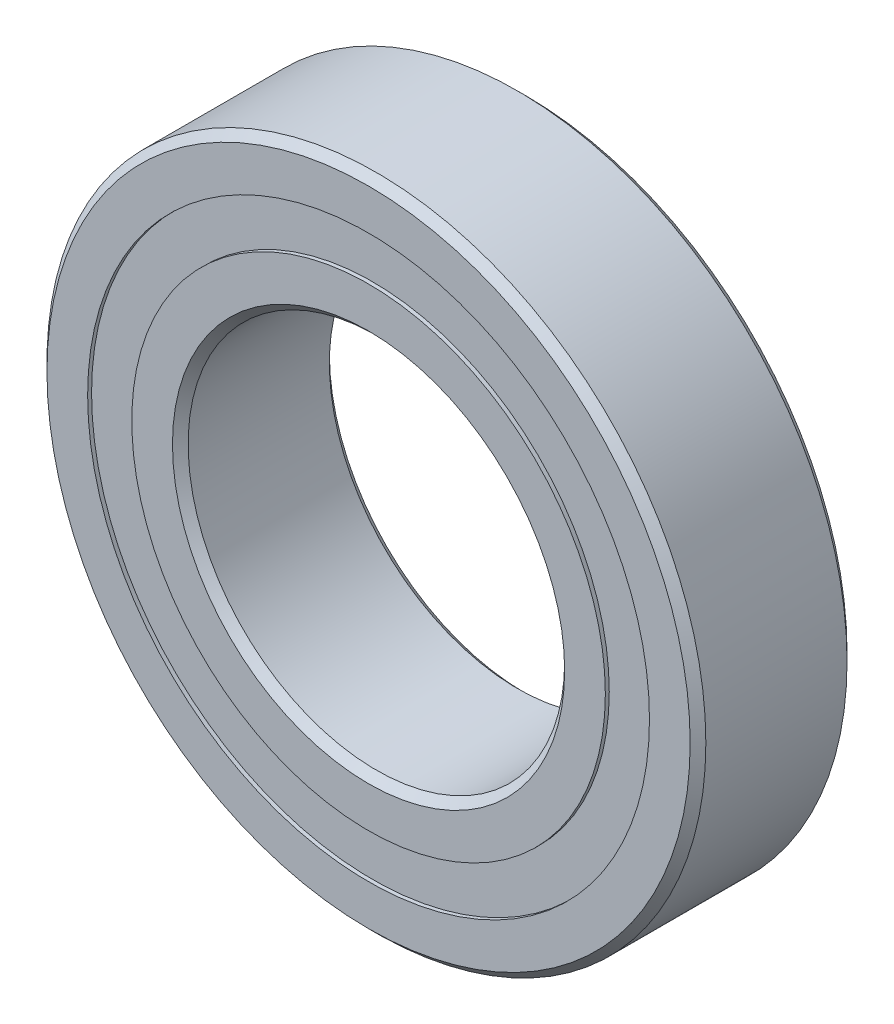
ISO-10303-21;
HEADER;
FILE_DESCRIPTION(('STEP AP214'),'2;1');
FILE_NAME('part.step','',(''),(''),'','','');
FILE_SCHEMA(('AUTOMOTIVE_DESIGN { 1 0 10303 214 1 1 1 1 }'));
ENDSEC;
DATA;
#1=APPLICATION_CONTEXT('core data for automotive mechanical design processes');
#2=APPLICATION_PROTOCOL_DEFINITION('international standard','automotive_design',2000,#1);
#3=PRODUCT_CONTEXT('',#1,'mechanical');
#4=PRODUCT('Part','Part','',(#3));
#5=PRODUCT_RELATED_PRODUCT_CATEGORY('part','',(#4));
#6=PRODUCT_DEFINITION_FORMATION('','',#4);
#7=PRODUCT_DEFINITION_CONTEXT('part definition',#1,'design');
#8=PRODUCT_DEFINITION('design','',#6,#7);
#9=PRODUCT_DEFINITION_SHAPE('','',#8);
#10=(LENGTH_UNIT() NAMED_UNIT(*) SI_UNIT(.MILLI.,.METRE.));
#11=(NAMED_UNIT(*) PLANE_ANGLE_UNIT() SI_UNIT($,.RADIAN.));
#12=(NAMED_UNIT(*) SI_UNIT($,.STERADIAN.) SOLID_ANGLE_UNIT());
#13=UNCERTAINTY_MEASURE_WITH_UNIT(LENGTH_MEASURE(1.E-05),#10,'distance_accuracy_value','');
#14=(GEOMETRIC_REPRESENTATION_CONTEXT(3) GLOBAL_UNCERTAINTY_ASSIGNED_CONTEXT((#13)) GLOBAL_UNIT_ASSIGNED_CONTEXT((#10,
#11,#12)) REPRESENTATION_CONTEXT('',''));
#15=CARTESIAN_POINT('',(0.,0.,0.));
#16=DIRECTION('',(0.,0.,1.));
#17=DIRECTION('',(1.,0.,0.));
#18=AXIS2_PLACEMENT_3D('',#15,#16,#17);
#19=CARTESIAN_POINT('',(0.,8.9532967032967,-2.375));
#20=DIRECTION('',(0.,0.,1.));
#21=DIRECTION('',(1.,0.,0.));
#22=AXIS2_PLACEMENT_3D('',#19,#20,#21);
#23=PLANE('',#22);
#24=CARTESIAN_POINT('',(0.,0.,-2.375));
#25=DIRECTION('',(0.,0.,1.));
#26=DIRECTION('',(1.,0.,0.));
#27=AXIS2_PLACEMENT_3D('',#24,#25,#26);
#28=CIRCLE('',#27,8.9532967032967);
#29=CARTESIAN_POINT('',(8.9532967032967,0.,-2.375));
#30=VERTEX_POINT('',#29);
#31=EDGE_CURVE('E56',#30,#30,#28,.T.);
#32=ORIENTED_EDGE('',*,*,#31,.F.);
#33=EDGE_LOOP('',(#32));
#34=FACE_BOUND('',#33,.T.);
#35=CARTESIAN_POINT('',(0.,0.,-2.375));
#36=DIRECTION('',(0.,0.,1.));
#37=DIRECTION('',(1.,0.,0.));
#38=AXIS2_PLACEMENT_3D('',#35,#36,#37);
#39=CIRCLE('',#38,7.5467032967033);
#40=CARTESIAN_POINT('',(7.5467032967033,0.,-2.375));
#41=VERTEX_POINT('',#40);
#42=EDGE_CURVE('E11',#41,#41,#39,.T.);
#43=ORIENTED_EDGE('',*,*,#42,.T.);
#44=EDGE_LOOP('',(#43));
#45=FACE_BOUND('',#44,.T.);
#46=ADVANCED_FACE('F42',(#34,#45),#23,.F.);
#47=CARTESIAN_POINT('',(0.,0.,2.5));
#48=DIRECTION('',(0.,0.,1.));
#49=DIRECTION('',(1.,0.,0.));
#50=AXIS2_PLACEMENT_3D('',#47,#48,#49);
#51=CYLINDRICAL_SURFACE('',#50,7.5467032967033);
#52=ORIENTED_EDGE('',*,*,#42,.F.);
#53=EDGE_LOOP('',(#52));
#54=FACE_BOUND('',#53,.T.);
#55=CARTESIAN_POINT('',(0.,0.,-1.31498827146959));
#56=DIRECTION('',(0.,0.,1.));
#57=DIRECTION('',(1.,0.,0.));
#58=AXIS2_PLACEMENT_3D('',#55,#56,#57);
#59=CIRCLE('',#58,7.5467032967033);
#60=CARTESIAN_POINT('',(7.5467032967033,0.,-1.31498827146959));
#61=VERTEX_POINT('',#60);
#62=EDGE_CURVE('E48',#61,#61,#59,.T.);
#63=ORIENTED_EDGE('',*,*,#62,.T.);
#64=EDGE_LOOP('',(#63));
#65=FACE_BOUND('',#64,.T.);
#66=ADVANCED_FACE('F65',(#54,#65),#51,.F.);
#67=CARTESIAN_POINT('',(0.,8.9532967032967,-1.31498827146959));
#68=DIRECTION('',(0.,0.,-1.));
#69=DIRECTION('',(-1.,0.,0.));
#70=AXIS2_PLACEMENT_3D('',#67,#68,#69);
#71=PLANE('',#70);
#72=ORIENTED_EDGE('',*,*,#62,.F.);
#73=EDGE_LOOP('',(#72));
#74=FACE_BOUND('',#73,.T.);
#75=CARTESIAN_POINT('',(0.,0.,-1.31498827146959));
#76=DIRECTION('',(0.,0.,1.));
#77=DIRECTION('',(1.,0.,0.));
#78=AXIS2_PLACEMENT_3D('',#75,#76,#77);
#79=CIRCLE('',#78,8.9532967032967);
#80=CARTESIAN_POINT('',(8.9532967032967,0.,-1.31498827146959));
#81=VERTEX_POINT('',#80);
#82=EDGE_CURVE('E52',#81,#81,#79,.T.);
#83=ORIENTED_EDGE('',*,*,#82,.T.);
#84=EDGE_LOOP('',(#83));
#85=FACE_BOUND('',#84,.T.);
#86=ADVANCED_FACE('F69',(#74,#85),#71,.F.);
#87=CARTESIAN_POINT('',(0.,0.,2.5));
#88=DIRECTION('',(0.,0.,1.));
#89=DIRECTION('',(1.,0.,0.));
#90=AXIS2_PLACEMENT_3D('',#87,#88,#89);
#91=CYLINDRICAL_SURFACE('',#90,8.9532967032967);
#92=ORIENTED_EDGE('',*,*,#82,.F.);
#93=EDGE_LOOP('',(#92));
#94=FACE_BOUND('',#93,.T.);
#95=ORIENTED_EDGE('',*,*,#31,.T.);
#96=EDGE_LOOP('',(#95));
#97=FACE_BOUND('',#96,.T.);
#98=ADVANCED_FACE('F62',(#94,#97),#91,.T.);
#99=CLOSED_SHELL('',(#46,#66,#86,#98));
#100=MANIFOLD_SOLID_BREP('B2',#99);
#101=CARTESIAN_POINT('',(0.,8.9532967032967,2.375));
#102=DIRECTION('',(0.,0.,-1.));
#103=DIRECTION('',(-1.,0.,0.));
#104=AXIS2_PLACEMENT_3D('',#101,#102,#103);
#105=PLANE('',#104);
#106=CARTESIAN_POINT('',(0.,0.,2.375));
#107=DIRECTION('',(0.,0.,1.));
#108=DIRECTION('',(1.,0.,0.));
#109=AXIS2_PLACEMENT_3D('',#106,#107,#108);
#110=CIRCLE('',#109,7.5467032967033);
#111=CARTESIAN_POINT('',(7.5467032967033,0.,2.375));
#112=VERTEX_POINT('',#111);
#113=EDGE_CURVE('E41',#112,#112,#110,.T.);
#114=ORIENTED_EDGE('',*,*,#113,.F.);
#115=EDGE_LOOP('',(#114));
#116=FACE_BOUND('',#115,.T.);
#117=CARTESIAN_POINT('',(0.,0.,2.375));
#118=DIRECTION('',(0.,0.,1.));
#119=DIRECTION('',(1.,0.,0.));
#120=AXIS2_PLACEMENT_3D('',#117,#118,#119);
#121=CIRCLE('',#120,8.9532967032967);
#122=CARTESIAN_POINT('',(8.9532967032967,0.,2.375));
#123=VERTEX_POINT('',#122);
#124=EDGE_CURVE('E124',#123,#123,#121,.T.);
#125=ORIENTED_EDGE('',*,*,#124,.T.);
#126=EDGE_LOOP('',(#125));
#127=FACE_BOUND('',#126,.T.);
#128=ADVANCED_FACE('F110',(#116,#127),#105,.F.);
#129=CARTESIAN_POINT('',(0.,0.,2.5));
#130=DIRECTION('',(0.,0.,1.));
#131=DIRECTION('',(1.,0.,0.));
#132=AXIS2_PLACEMENT_3D('',#129,#130,#131);
#133=CYLINDRICAL_SURFACE('',#132,7.5467032967033);
#134=CARTESIAN_POINT('',(0.,0.,1.31498827146959));
#135=DIRECTION('',(0.,0.,1.));
#136=DIRECTION('',(1.,0.,0.));
#137=AXIS2_PLACEMENT_3D('',#134,#135,#136);
#138=CIRCLE('',#137,7.5467032967033);
#139=CARTESIAN_POINT('',(7.5467032967033,0.,1.31498827146959));
#140=VERTEX_POINT('',#139);
#141=EDGE_CURVE('E116',#140,#140,#138,.T.);
#142=ORIENTED_EDGE('',*,*,#141,.F.);
#143=EDGE_LOOP('',(#142));
#144=FACE_BOUND('',#143,.T.);
#145=ORIENTED_EDGE('',*,*,#113,.T.);
#146=EDGE_LOOP('',(#145));
#147=FACE_BOUND('',#146,.T.);
#148=ADVANCED_FACE('F139',(#144,#147),#133,.F.);
#149=CARTESIAN_POINT('',(0.,8.9532967032967,1.31498827146959));
#150=DIRECTION('',(0.,0.,1.));
#151=DIRECTION('',(1.,0.,0.));
#152=AXIS2_PLACEMENT_3D('',#149,#150,#151);
#153=PLANE('',#152);
#154=CARTESIAN_POINT('',(0.,0.,1.31498827146959));
#155=DIRECTION('',(0.,0.,1.));
#156=DIRECTION('',(1.,0.,0.));
#157=AXIS2_PLACEMENT_3D('',#154,#155,#156);
#158=CIRCLE('',#157,8.9532967032967);
#159=CARTESIAN_POINT('',(8.9532967032967,0.,1.31498827146959));
#160=VERTEX_POINT('',#159);
#161=EDGE_CURVE('E120',#160,#160,#158,.T.);
#162=ORIENTED_EDGE('',*,*,#161,.F.);
#163=EDGE_LOOP('',(#162));
#164=FACE_BOUND('',#163,.T.);
#165=ORIENTED_EDGE('',*,*,#141,.T.);
#166=EDGE_LOOP('',(#165));
#167=FACE_BOUND('',#166,.T.);
#168=ADVANCED_FACE('F134',(#164,#167),#153,.F.);
#169=CARTESIAN_POINT('',(0.,0.,2.5));
#170=DIRECTION('',(0.,0.,1.));
#171=DIRECTION('',(1.,0.,0.));
#172=AXIS2_PLACEMENT_3D('',#169,#170,#171);
#173=CYLINDRICAL_SURFACE('',#172,8.9532967032967);
#174=ORIENTED_EDGE('',*,*,#124,.F.);
#175=EDGE_LOOP('',(#174));
#176=FACE_BOUND('',#175,.T.);
#177=ORIENTED_EDGE('',*,*,#161,.T.);
#178=EDGE_LOOP('',(#177));
#179=FACE_BOUND('',#178,.T.);
#180=ADVANCED_FACE('F131',(#176,#179),#173,.T.);
#181=CLOSED_SHELL('',(#128,#148,#168,#180));
#182=MANIFOLD_SOLID_BREP('B6',#181);
#183=CARTESIAN_POINT('',(-4.12499999999991,7.14470958122167,0.));
#184=DIRECTION('',(0.,0.,1.));
#185=DIRECTION('',(-0.499999999999989,0.866025403784445,0.));
#186=AXIS2_PLACEMENT_3D('',#183,#184,#185);
#187=SPHERICAL_SURFACE('',#186,1.31498827146959);
#188=CARTESIAN_POINT('',(-4.12499999999991,7.14470958122167,1.31498827146959));
#189=VERTEX_POINT('',#188);
#190=VERTEX_LOOP('',#189);
#191=FACE_BOUND('',#190,.T.);
#192=ADVANCED_FACE('F177',(#191),#187,.T.);
#193=CLOSED_SHELL('',(#192));
#194=MANIFOLD_SOLID_BREP('B36',#193);
#195=CARTESIAN_POINT('',(-7.14470958122157,4.12500000000008,0.));
#196=DIRECTION('',(0.,0.,1.));
#197=DIRECTION('',(-0.866025403784433,0.50000000000001,0.));
#198=AXIS2_PLACEMENT_3D('',#195,#196,#197);
#199=SPHERICAL_SURFACE('',#198,1.31498827146959);
#200=CARTESIAN_POINT('',(-7.14470958122157,4.12500000000008,1.31498827146959));
#201=VERTEX_POINT('',#200);
#202=VERTEX_LOOP('',#201);
#203=FACE_BOUND('',#202,.T.);
#204=ADVANCED_FACE('F197',(#203),#199,.T.);
#205=CLOSED_SHELL('',(#204));
#206=MANIFOLD_SOLID_BREP('B106',#205);
#207=CARTESIAN_POINT('',(-8.25,0.,0.));
#208=DIRECTION('',(0.,0.,1.));
#209=DIRECTION('',(-1.,0.,0.));
#210=AXIS2_PLACEMENT_3D('',#207,#208,#209);
#211=SPHERICAL_SURFACE('',#210,1.31498827146959);
#212=CARTESIAN_POINT('',(-8.25,0.,1.31498827146959));
#213=VERTEX_POINT('',#212);
#214=VERTEX_LOOP('',#213);
#215=FACE_BOUND('',#214,.T.);
#216=ADVANCED_FACE('F217',(#215),#211,.T.);
#217=CLOSED_SHELL('',(#216));
#218=MANIFOLD_SOLID_BREP('B173',#217);
#219=CARTESIAN_POINT('',(-7.14470958122166,-4.12499999999993,0.));
#220=DIRECTION('',(0.,0.,1.));
#221=DIRECTION('',(-0.866025403784443,-0.499999999999992,0.));
#222=AXIS2_PLACEMENT_3D('',#219,#220,#221);
#223=SPHERICAL_SURFACE('',#222,1.31498827146959);
#224=CARTESIAN_POINT('',(-7.14470958122166,-4.12499999999993,1.31498827146959));
#225=VERTEX_POINT('',#224);
#226=VERTEX_LOOP('',#225);
#227=FACE_BOUND('',#226,.T.);
#228=ADVANCED_FACE('F237',(#227),#223,.T.);
#229=CLOSED_SHELL('',(#228));
#230=MANIFOLD_SOLID_BREP('B193',#229);
#231=CARTESIAN_POINT('',(-4.12500000000006,-7.14470958122159,0.));
#232=DIRECTION('',(0.,0.,1.));
#233=DIRECTION('',(-0.500000000000007,-0.866025403784435,0.));
#234=AXIS2_PLACEMENT_3D('',#231,#232,#233);
#235=SPHERICAL_SURFACE('',#234,1.31498827146959);
#236=CARTESIAN_POINT('',(-4.12500000000006,-7.14470958122159,1.31498827146959));
#237=VERTEX_POINT('',#236);
#238=VERTEX_LOOP('',#237);
#239=FACE_BOUND('',#238,.T.);
#240=ADVANCED_FACE('F257',(#239),#235,.T.);
#241=CLOSED_SHELL('',(#240));
#242=MANIFOLD_SOLID_BREP('B213',#241);
#243=CARTESIAN_POINT('',(0.,-8.25,0.));
#244=DIRECTION('',(0.,0.,1.));
#245=DIRECTION('',(0.,-1.,0.));
#246=AXIS2_PLACEMENT_3D('',#243,#244,#245);
#247=SPHERICAL_SURFACE('',#246,1.31498827146959);
#248=CARTESIAN_POINT('',(0.,-8.25,1.31498827146959));
#249=VERTEX_POINT('',#248);
#250=VERTEX_LOOP('',#249);
#251=FACE_BOUND('',#250,.T.);
#252=ADVANCED_FACE('F277',(#251),#247,.T.);
#253=CLOSED_SHELL('',(#252));
#254=MANIFOLD_SOLID_BREP('B233',#253);
#255=CARTESIAN_POINT('',(4.12499999999996,-7.14470958122164,0.));
#256=DIRECTION('',(0.,0.,1.));
#257=DIRECTION('',(0.499999999999995,-0.866025403784442,0.));
#258=AXIS2_PLACEMENT_3D('',#255,#256,#257);
#259=SPHERICAL_SURFACE('',#258,1.31498827146959);
#260=CARTESIAN_POINT('',(4.12499999999996,-7.14470958122164,1.31498827146959));
#261=VERTEX_POINT('',#260);
#262=VERTEX_LOOP('',#261);
#263=FACE_BOUND('',#262,.T.);
#264=ADVANCED_FACE('F297',(#263),#259,.T.);
#265=CLOSED_SHELL('',(#264));
#266=MANIFOLD_SOLID_BREP('B253',#265);
#267=CARTESIAN_POINT('',(7.1447095812216,-4.12500000000003,0.));
#268=DIRECTION('',(0.,0.,1.));
#269=DIRECTION('',(0.866025403784436,-0.500000000000004,0.));
#270=AXIS2_PLACEMENT_3D('',#267,#268,#269);
#271=SPHERICAL_SURFACE('',#270,1.31498827146959);
#272=CARTESIAN_POINT('',(7.1447095812216,-4.12500000000003,1.31498827146959));
#273=VERTEX_POINT('',#272);
#274=VERTEX_LOOP('',#273);
#275=FACE_BOUND('',#274,.T.);
#276=ADVANCED_FACE('F317',(#275),#271,.T.);
#277=CLOSED_SHELL('',(#276));
#278=MANIFOLD_SOLID_BREP('B273',#277);
#279=CARTESIAN_POINT('',(8.25,0.,0.));
#280=DIRECTION('',(0.,0.,1.));
#281=DIRECTION('',(1.,0.,0.));
#282=AXIS2_PLACEMENT_3D('',#279,#280,#281);
#283=SPHERICAL_SURFACE('',#282,1.31498827146959);
#284=CARTESIAN_POINT('',(8.25,0.,1.31498827146959));
#285=VERTEX_POINT('',#284);
#286=VERTEX_LOOP('',#285);
#287=FACE_BOUND('',#286,.T.);
#288=ADVANCED_FACE('F337',(#287),#283,.T.);
#289=CLOSED_SHELL('',(#288));
#290=MANIFOLD_SOLID_BREP('B293',#289);
#291=CARTESIAN_POINT('',(7.14470958122163,4.12499999999998,0.));
#292=DIRECTION('',(0.,0.,1.));
#293=DIRECTION('',(0.86602540378444,0.499999999999998,0.));
#294=AXIS2_PLACEMENT_3D('',#291,#292,#293);
#295=SPHERICAL_SURFACE('',#294,1.31498827146959);
#296=CARTESIAN_POINT('',(7.14470958122163,4.12499999999998,1.31498827146959));
#297=VERTEX_POINT('',#296);
#298=VERTEX_LOOP('',#297);
#299=FACE_BOUND('',#298,.T.);
#300=ADVANCED_FACE('F357',(#299),#295,.T.);
#301=CLOSED_SHELL('',(#300));
#302=MANIFOLD_SOLID_BREP('B313',#301);
#303=CARTESIAN_POINT('',(4.12500000000001,7.14470958122161,0.));
#304=DIRECTION('',(0.,0.,1.));
#305=DIRECTION('',(0.500000000000001,0.866025403784438,0.));
#306=AXIS2_PLACEMENT_3D('',#303,#304,#305);
#307=SPHERICAL_SURFACE('',#306,1.31498827146959);
#308=CARTESIAN_POINT('',(4.12500000000001,7.14470958122161,1.31498827146959));
#309=VERTEX_POINT('',#308);
#310=VERTEX_LOOP('',#309);
#311=FACE_BOUND('',#310,.T.);
#312=ADVANCED_FACE('F377',(#311),#307,.T.);
#313=CLOSED_SHELL('',(#312));
#314=MANIFOLD_SOLID_BREP('B333',#313);
#315=CARTESIAN_POINT('',(0.,8.25,0.));
#316=DIRECTION('',(0.,0.,1.));
#317=DIRECTION('',(0.,1.,0.));
#318=AXIS2_PLACEMENT_3D('',#315,#316,#317);
#319=SPHERICAL_SURFACE('',#318,1.31498827146959);
#320=CARTESIAN_POINT('',(0.,8.25,1.31498827146959));
#321=VERTEX_POINT('',#320);
#322=VERTEX_LOOP('',#321);
#323=FACE_BOUND('',#322,.T.);
#324=ADVANCED_FACE('F400',(#323),#319,.T.);
#325=CLOSED_SHELL('',(#324));
#326=MANIFOLD_SOLID_BREP('B353',#325);
#327=CARTESIAN_POINT('',(0.,7.5467032967033,2.5));
#328=DIRECTION('',(0.,0.,-1.));
#329=DIRECTION('',(-1.,0.,0.));
#330=AXIS2_PLACEMENT_3D('',#327,#328,#329);
#331=PLANE('',#330);
#332=CARTESIAN_POINT('',(0.,0.,2.5));
#333=DIRECTION('',(0.,0.,1.));
#334=DIRECTION('',(1.,0.,0.));
#335=AXIS2_PLACEMENT_3D('',#332,#333,#334);
#336=CIRCLE('',#335,6.25);
#337=CARTESIAN_POINT('',(6.25,0.,2.5));
#338=VERTEX_POINT('',#337);
#339=EDGE_CURVE('E448',#338,#338,#336,.T.);
#340=ORIENTED_EDGE('',*,*,#339,.F.);
#341=EDGE_LOOP('',(#340));
#342=FACE_BOUND('',#341,.T.);
#343=CARTESIAN_POINT('',(0.,0.,2.5));
#344=DIRECTION('',(0.,0.,1.));
#345=DIRECTION('',(1.,0.,0.));
#346=AXIS2_PLACEMENT_3D('',#343,#344,#345);
#347=CIRCLE('',#346,7.5467032967033);
#348=CARTESIAN_POINT('',(7.5467032967033,0.,2.5));
#349=VERTEX_POINT('',#348);
#350=EDGE_CURVE('E399',#349,#349,#347,.T.);
#351=ORIENTED_EDGE('',*,*,#350,.T.);
#352=EDGE_LOOP('',(#351));
#353=FACE_BOUND('',#352,.T.);
#354=ADVANCED_FACE('F420',(#342,#353),#331,.F.);
#355=CARTESIAN_POINT('',(0.,0.,2.5));
#356=DIRECTION('',(0.,0.,1.));
#357=DIRECTION('',(1.,0.,0.));
#358=AXIS2_PLACEMENT_3D('',#355,#356,#357);
#359=CYLINDRICAL_SURFACE('',#358,7.5467032967033);
#360=ORIENTED_EDGE('',*,*,#350,.F.);
#361=EDGE_LOOP('',(#360));
#362=FACE_BOUND('',#361,.T.);
#363=CARTESIAN_POINT('',(0.,0.,1.11111111111111));
#364=DIRECTION('',(0.,0.,1.));
#365=DIRECTION('',(1.,0.,0.));
#366=AXIS2_PLACEMENT_3D('',#363,#364,#365);
#367=CIRCLE('',#366,7.5467032967033);
#368=CARTESIAN_POINT('',(7.5467032967033,0.,1.11111111111111));
#369=VERTEX_POINT('',#368);
#370=EDGE_CURVE('E426',#369,#369,#367,.T.);
#371=ORIENTED_EDGE('',*,*,#370,.T.);
#372=EDGE_LOOP('',(#371));
#373=FACE_BOUND('',#372,.T.);
#374=ADVANCED_FACE('F455',(#362,#373),#359,.T.);
#375=CARTESIAN_POINT('',(0.,0.,0.));
#376=DIRECTION('',(0.,0.,1.));
#377=DIRECTION('',(1.,0.,0.));
#378=AXIS2_PLACEMENT_3D('',#375,#376,#377);
#379=TOROIDAL_SURFACE('',#378,8.24999999999999,1.31498827146959);
#380=ORIENTED_EDGE('',*,*,#370,.F.);
#381=EDGE_LOOP('',(#380));
#382=FACE_BOUND('',#381,.T.);
#383=CARTESIAN_POINT('',(0.,0.,-1.11111111111111));
#384=DIRECTION('',(0.,0.,1.));
#385=DIRECTION('',(1.,0.,0.));
#386=AXIS2_PLACEMENT_3D('',#383,#384,#385);
#387=CIRCLE('',#386,7.5467032967033);
#388=CARTESIAN_POINT('',(7.5467032967033,0.,-1.11111111111111));
#389=VERTEX_POINT('',#388);
#390=EDGE_CURVE('E430',#389,#389,#387,.T.);
#391=ORIENTED_EDGE('',*,*,#390,.T.);
#392=EDGE_LOOP('',(#391));
#393=FACE_BOUND('',#392,.T.);
#394=ADVANCED_FACE('F459',(#382,#393),#379,.F.);
#395=CARTESIAN_POINT('',(0.,0.,2.5));
#396=DIRECTION('',(0.,0.,1.));
#397=DIRECTION('',(1.,0.,0.));
#398=AXIS2_PLACEMENT_3D('',#395,#396,#397);
#399=CYLINDRICAL_SURFACE('',#398,7.5467032967033);
#400=ORIENTED_EDGE('',*,*,#390,.F.);
#401=EDGE_LOOP('',(#400));
#402=FACE_BOUND('',#401,.T.);
#403=CARTESIAN_POINT('',(0.,0.,-2.5));
#404=DIRECTION('',(0.,0.,1.));
#405=DIRECTION('',(1.,0.,0.));
#406=AXIS2_PLACEMENT_3D('',#403,#404,#405);
#407=CIRCLE('',#406,7.5467032967033);
#408=CARTESIAN_POINT('',(7.5467032967033,0.,-2.5));
#409=VERTEX_POINT('',#408);
#410=EDGE_CURVE('E434',#409,#409,#407,.T.);
#411=ORIENTED_EDGE('',*,*,#410,.T.);
#412=EDGE_LOOP('',(#411));
#413=FACE_BOUND('',#412,.T.);
#414=ADVANCED_FACE('F464',(#402,#413),#399,.T.);
#415=CARTESIAN_POINT('',(0.,6.25,-2.5));
#416=DIRECTION('',(0.,0.,1.));
#417=DIRECTION('',(1.,0.,0.));
#418=AXIS2_PLACEMENT_3D('',#415,#416,#417);
#419=PLANE('',#418);
#420=ORIENTED_EDGE('',*,*,#410,.F.);
#421=EDGE_LOOP('',(#420));
#422=FACE_BOUND('',#421,.T.);
#423=CARTESIAN_POINT('',(0.,0.,-2.5));
#424=DIRECTION('',(0.,0.,1.));
#425=DIRECTION('',(1.,0.,0.));
#426=AXIS2_PLACEMENT_3D('',#423,#424,#425);
#427=CIRCLE('',#426,6.25);
#428=CARTESIAN_POINT('',(6.25,0.,-2.5));
#429=VERTEX_POINT('',#428);
#430=EDGE_CURVE('E439',#429,#429,#427,.T.);
#431=ORIENTED_EDGE('',*,*,#430,.T.);
#432=EDGE_LOOP('',(#431));
#433=FACE_BOUND('',#432,.T.);
#434=ADVANCED_FACE('F470',(#422,#433),#419,.F.);
#435=CARTESIAN_POINT('',(0.,0.,-2.25));
#436=DIRECTION('',(0.,0.,-1.));
#437=DIRECTION('',(-1.,0.,0.));
#438=AXIS2_PLACEMENT_3D('',#435,#436,#437);
#439=CONICAL_SURFACE('',#438,6.,0.785398163397448);
#440=ORIENTED_EDGE('',*,*,#430,.F.);
#441=EDGE_LOOP('',(#440));
#442=FACE_BOUND('',#441,.T.);
#443=CARTESIAN_POINT('',(0.,0.,-2.25));
#444=DIRECTION('',(0.,0.,1.));
#445=DIRECTION('',(1.,0.,0.));
#446=AXIS2_PLACEMENT_3D('',#443,#444,#445);
#447=CIRCLE('',#446,6.);
#448=CARTESIAN_POINT('',(6.,0.,-2.25));
#449=VERTEX_POINT('',#448);
#450=EDGE_CURVE('E442',#449,#449,#447,.T.);
#451=ORIENTED_EDGE('',*,*,#450,.T.);
#452=EDGE_LOOP('',(#451));
#453=FACE_BOUND('',#452,.T.);
#454=ADVANCED_FACE('F474',(#442,#453),#439,.F.);
#455=CARTESIAN_POINT('',(0.,0.,2.5));
#456=DIRECTION('',(0.,0.,1.));
#457=DIRECTION('',(1.,0.,0.));
#458=AXIS2_PLACEMENT_3D('',#455,#456,#457);
#459=CYLINDRICAL_SURFACE('',#458,6.);
#460=ORIENTED_EDGE('',*,*,#450,.F.);
#461=EDGE_LOOP('',(#460));
#462=FACE_BOUND('',#461,.T.);
#463=CARTESIAN_POINT('',(0.,0.,2.25));
#464=DIRECTION('',(0.,0.,1.));
#465=DIRECTION('',(1.,0.,0.));
#466=AXIS2_PLACEMENT_3D('',#463,#464,#465);
#467=CIRCLE('',#466,6.);
#468=CARTESIAN_POINT('',(6.,0.,2.25));
#469=VERTEX_POINT('',#468);
#470=EDGE_CURVE('E445',#469,#469,#467,.T.);
#471=ORIENTED_EDGE('',*,*,#470,.T.);
#472=EDGE_LOOP('',(#471));
#473=FACE_BOUND('',#472,.T.);
#474=ADVANCED_FACE('F478',(#462,#473),#459,.F.);
#475=CARTESIAN_POINT('',(0.,0.,2.5));
#476=DIRECTION('',(0.,0.,1.));
#477=DIRECTION('',(1.,0.,0.));
#478=AXIS2_PLACEMENT_3D('',#475,#476,#477);
#479=CONICAL_SURFACE('',#478,6.25,0.785398163397449);
#480=ORIENTED_EDGE('',*,*,#470,.F.);
#481=EDGE_LOOP('',(#480));
#482=FACE_BOUND('',#481,.T.);
#483=ORIENTED_EDGE('',*,*,#339,.T.);
#484=EDGE_LOOP('',(#483));
#485=FACE_BOUND('',#484,.T.);
#486=ADVANCED_FACE('F452',(#482,#485),#479,.F.);
#487=CLOSED_SHELL('',(#354,#374,#394,#414,#434,#454,#474,#486));
#488=MANIFOLD_SOLID_BREP('B373',#487);
#489=CARTESIAN_POINT('',(0.,0.,2.25));
#490=DIRECTION('',(0.,0.,-1.));
#491=DIRECTION('',(-1.,0.,0.));
#492=AXIS2_PLACEMENT_3D('',#489,#490,#491);
#493=CONICAL_SURFACE('',#492,10.5,0.785398163397449);
#494=CARTESIAN_POINT('',(0.,0.,2.5));
#495=DIRECTION('',(0.,0.,1.));
#496=DIRECTION('',(1.,0.,0.));
#497=AXIS2_PLACEMENT_3D('',#494,#495,#496);
#498=CIRCLE('',#497,10.25);
#499=CARTESIAN_POINT('',(10.25,0.,2.5));
#500=VERTEX_POINT('',#499);
#501=EDGE_CURVE('E570',#500,#500,#498,.T.);
#502=ORIENTED_EDGE('',*,*,#501,.F.);
#503=EDGE_LOOP('',(#502));
#504=FACE_BOUND('',#503,.T.);
#505=CARTESIAN_POINT('',(0.,0.,2.25));
#506=DIRECTION('',(0.,0.,1.));
#507=DIRECTION('',(1.,0.,0.));
#508=AXIS2_PLACEMENT_3D('',#505,#506,#507);
#509=CIRCLE('',#508,10.5);
#510=CARTESIAN_POINT('',(10.5,0.,2.25));
#511=VERTEX_POINT('',#510);
#512=EDGE_CURVE('E419',#511,#511,#509,.T.);
#513=ORIENTED_EDGE('',*,*,#512,.T.);
#514=EDGE_LOOP('',(#513));
#515=FACE_BOUND('',#514,.T.);
#516=ADVANCED_FACE('F542',(#504,#515),#493,.T.);
#517=CARTESIAN_POINT('',(0.,0.,2.5));
#518=DIRECTION('',(0.,0.,1.));
#519=DIRECTION('',(1.,0.,0.));
#520=AXIS2_PLACEMENT_3D('',#517,#518,#519);
#521=CYLINDRICAL_SURFACE('',#520,10.5);
#522=ORIENTED_EDGE('',*,*,#512,.F.);
#523=EDGE_LOOP('',(#522));
#524=FACE_BOUND('',#523,.T.);
#525=CARTESIAN_POINT('',(0.,0.,-2.25));
#526=DIRECTION('',(0.,0.,1.));
#527=DIRECTION('',(1.,0.,0.));
#528=AXIS2_PLACEMENT_3D('',#525,#526,#527);
#529=CIRCLE('',#528,10.5);
#530=CARTESIAN_POINT('',(10.5,0.,-2.25));
#531=VERTEX_POINT('',#530);
#532=EDGE_CURVE('E548',#531,#531,#529,.T.);
#533=ORIENTED_EDGE('',*,*,#532,.T.);
#534=EDGE_LOOP('',(#533));
#535=FACE_BOUND('',#534,.T.);
#536=ADVANCED_FACE('F577',(#524,#535),#521,.T.);
#537=CARTESIAN_POINT('',(0.,0.,-2.5));
#538=DIRECTION('',(0.,0.,1.));
#539=DIRECTION('',(1.,0.,0.));
#540=AXIS2_PLACEMENT_3D('',#537,#538,#539);
#541=CONICAL_SURFACE('',#540,10.25,0.785398163397448);
#542=ORIENTED_EDGE('',*,*,#532,.F.);
#543=EDGE_LOOP('',(#542));
#544=FACE_BOUND('',#543,.T.);
#545=CARTESIAN_POINT('',(0.,0.,-2.5));
#546=DIRECTION('',(0.,0.,1.));
#547=DIRECTION('',(1.,0.,0.));
#548=AXIS2_PLACEMENT_3D('',#545,#546,#547);
#549=CIRCLE('',#548,10.25);
#550=CARTESIAN_POINT('',(10.25,0.,-2.5));
#551=VERTEX_POINT('',#550);
#552=EDGE_CURVE('E552',#551,#551,#549,.T.);
#553=ORIENTED_EDGE('',*,*,#552,.T.);
#554=EDGE_LOOP('',(#553));
#555=FACE_BOUND('',#554,.T.);
#556=ADVANCED_FACE('F581',(#544,#555),#541,.T.);
#557=CARTESIAN_POINT('',(0.,10.25,-2.5));
#558=DIRECTION('',(0.,0.,1.));
#559=DIRECTION('',(1.,0.,0.));
#560=AXIS2_PLACEMENT_3D('',#557,#558,#559);
#561=PLANE('',#560);
#562=ORIENTED_EDGE('',*,*,#552,.F.);
#563=EDGE_LOOP('',(#562));
#564=FACE_BOUND('',#563,.T.);
#565=CARTESIAN_POINT('',(0.,0.,-2.5));
#566=DIRECTION('',(0.,0.,1.));
#567=DIRECTION('',(1.,0.,0.));
#568=AXIS2_PLACEMENT_3D('',#565,#566,#567);
#569=CIRCLE('',#568,8.9532967032967);
#570=CARTESIAN_POINT('',(8.9532967032967,0.,-2.5));
#571=VERTEX_POINT('',#570);
#572=EDGE_CURVE('E556',#571,#571,#569,.T.);
#573=ORIENTED_EDGE('',*,*,#572,.T.);
#574=EDGE_LOOP('',(#573));
#575=FACE_BOUND('',#574,.T.);
#576=ADVANCED_FACE('F586',(#564,#575),#561,.F.);
#577=CARTESIAN_POINT('',(0.,0.,2.5));
#578=DIRECTION('',(0.,0.,1.));
#579=DIRECTION('',(1.,0.,0.));
#580=AXIS2_PLACEMENT_3D('',#577,#578,#579);
#581=CYLINDRICAL_SURFACE('',#580,8.9532967032967);
#582=ORIENTED_EDGE('',*,*,#572,.F.);
#583=EDGE_LOOP('',(#582));
#584=FACE_BOUND('',#583,.T.);
#585=CARTESIAN_POINT('',(0.,0.,-1.11111111111111));
#586=DIRECTION('',(0.,0.,1.));
#587=DIRECTION('',(1.,0.,0.));
#588=AXIS2_PLACEMENT_3D('',#585,#586,#587);
#589=CIRCLE('',#588,8.9532967032967);
#590=CARTESIAN_POINT('',(8.9532967032967,0.,-1.11111111111111));
#591=VERTEX_POINT('',#590);
#592=EDGE_CURVE('E561',#591,#591,#589,.T.);
#593=ORIENTED_EDGE('',*,*,#592,.T.);
#594=EDGE_LOOP('',(#593));
#595=FACE_BOUND('',#594,.T.);
#596=ADVANCED_FACE('F592',(#584,#595),#581,.F.);
#597=CARTESIAN_POINT('',(0.,0.,0.));
#598=DIRECTION('',(0.,0.,1.));
#599=DIRECTION('',(1.,0.,0.));
#600=AXIS2_PLACEMENT_3D('',#597,#598,#599);
#601=TOROIDAL_SURFACE('',#600,8.25,1.31498827146959);
#602=ORIENTED_EDGE('',*,*,#592,.F.);
#603=EDGE_LOOP('',(#602));
#604=FACE_BOUND('',#603,.T.);
#605=CARTESIAN_POINT('',(0.,0.,1.11111111111111));
#606=DIRECTION('',(0.,0.,1.));
#607=DIRECTION('',(1.,0.,0.));
#608=AXIS2_PLACEMENT_3D('',#605,#606,#607);
#609=CIRCLE('',#608,8.9532967032967);
#610=CARTESIAN_POINT('',(8.9532967032967,0.,1.11111111111111));
#611=VERTEX_POINT('',#610);
#612=EDGE_CURVE('E564',#611,#611,#609,.T.);
#613=ORIENTED_EDGE('',*,*,#612,.T.);
#614=EDGE_LOOP('',(#613));
#615=FACE_BOUND('',#614,.T.);
#616=ADVANCED_FACE('F596',(#604,#615),#601,.F.);
#617=CARTESIAN_POINT('',(0.,0.,2.5));
#618=DIRECTION('',(0.,0.,1.));
#619=DIRECTION('',(1.,0.,0.));
#620=AXIS2_PLACEMENT_3D('',#617,#618,#619);
#621=CYLINDRICAL_SURFACE('',#620,8.9532967032967);
#622=ORIENTED_EDGE('',*,*,#612,.F.);
#623=EDGE_LOOP('',(#622));
#624=FACE_BOUND('',#623,.T.);
#625=CARTESIAN_POINT('',(0.,0.,2.5));
#626=DIRECTION('',(0.,0.,1.));
#627=DIRECTION('',(1.,0.,0.));
#628=AXIS2_PLACEMENT_3D('',#625,#626,#627);
#629=CIRCLE('',#628,8.9532967032967);
#630=CARTESIAN_POINT('',(8.9532967032967,0.,2.5));
#631=VERTEX_POINT('',#630);
#632=EDGE_CURVE('E567',#631,#631,#629,.T.);
#633=ORIENTED_EDGE('',*,*,#632,.T.);
#634=EDGE_LOOP('',(#633));
#635=FACE_BOUND('',#634,.T.);
#636=ADVANCED_FACE('F600',(#624,#635),#621,.F.);
#637=CARTESIAN_POINT('',(0.,10.25,2.5));
#638=DIRECTION('',(0.,0.,-1.));
#639=DIRECTION('',(-1.,0.,0.));
#640=AXIS2_PLACEMENT_3D('',#637,#638,#639);
#641=PLANE('',#640);
#642=ORIENTED_EDGE('',*,*,#632,.F.);
#643=EDGE_LOOP('',(#642));
#644=FACE_BOUND('',#643,.T.);
#645=ORIENTED_EDGE('',*,*,#501,.T.);
#646=EDGE_LOOP('',(#645));
#647=FACE_BOUND('',#646,.T.);
#648=ADVANCED_FACE('F574',(#644,#647),#641,.F.);
#649=CLOSED_SHELL('',(#516,#536,#556,#576,#596,#616,#636,#648));
#650=MANIFOLD_SOLID_BREP('B394',#649);
#651=ADVANCED_BREP_SHAPE_REPRESENTATION('',(#18,#100,#182,#194,#206,#218,#230,#242,#254,#266,
#278,#290,#302,#314,#326,#488,#650),#14);
#652=SHAPE_DEFINITION_REPRESENTATION(#9,#651);
ENDSEC;
END-ISO-10303-21;
